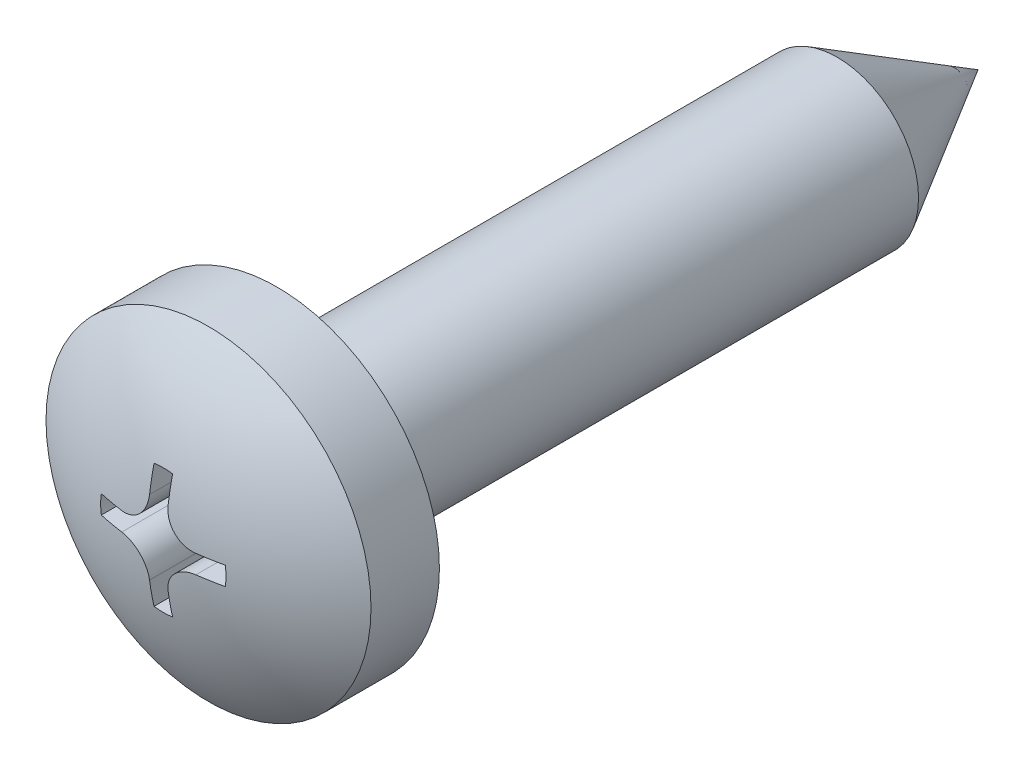
ISO-10303-21;
HEADER;
FILE_DESCRIPTION(('STEP AP214'),'2;1');
FILE_NAME('part.step','',(''),(''),'','','');
FILE_SCHEMA(('AUTOMOTIVE_DESIGN { 1 0 10303 214 1 1 1 1 }'));
ENDSEC;
DATA;
#1=APPLICATION_CONTEXT('core data for automotive mechanical design processes');
#2=APPLICATION_PROTOCOL_DEFINITION('international standard','automotive_design',2000,#1);
#3=PRODUCT_CONTEXT('',#1,'mechanical');
#4=PRODUCT('Part','Part','',(#3));
#5=PRODUCT_RELATED_PRODUCT_CATEGORY('part','',(#4));
#6=PRODUCT_DEFINITION_FORMATION('','',#4);
#7=PRODUCT_DEFINITION_CONTEXT('part definition',#1,'design');
#8=PRODUCT_DEFINITION('design','',#6,#7);
#9=PRODUCT_DEFINITION_SHAPE('','',#8);
#10=(LENGTH_UNIT() NAMED_UNIT(*) SI_UNIT(.MILLI.,.METRE.));
#11=(NAMED_UNIT(*) PLANE_ANGLE_UNIT() SI_UNIT($,.RADIAN.));
#12=(NAMED_UNIT(*) SI_UNIT($,.STERADIAN.) SOLID_ANGLE_UNIT());
#13=UNCERTAINTY_MEASURE_WITH_UNIT(LENGTH_MEASURE(1.E-05),#10,'distance_accuracy_value','');
#14=(GEOMETRIC_REPRESENTATION_CONTEXT(3) GLOBAL_UNCERTAINTY_ASSIGNED_CONTEXT((#13)) GLOBAL_UNIT_ASSIGNED_CONTEXT((#10,
#11,#12)) REPRESENTATION_CONTEXT('',''));
#15=CARTESIAN_POINT('',(0.,0.,0.));
#16=DIRECTION('',(0.,0.,1.));
#17=DIRECTION('',(1.,0.,0.));
#18=AXIS2_PLACEMENT_3D('',#15,#16,#17);
#19=CARTESIAN_POINT('',(0.,0.,11.7));
#20=DIRECTION('',(0.,0.,1.));
#21=DIRECTION('',(0.,1.,0.));
#22=AXIS2_PLACEMENT_3D('',#19,#20,#21);
#23=SPHERICAL_SURFACE('',#22,6.);
#24=CARTESIAN_POINT('',(0.,0.,16.5733971724045));
#25=DIRECTION('',(0.,0.,1.));
#26=DIRECTION('',(1.,0.,0.));
#27=AXIS2_PLACEMENT_3D('',#24,#25,#26);
#28=CIRCLE('',#27,3.5);
#29=CARTESIAN_POINT('',(3.5,0.,16.5733971724045));
#30=VERTEX_POINT('',#29);
#31=EDGE_CURVE('E194',#30,#30,#28,.T.);
#32=ORIENTED_EDGE('',*,*,#31,.T.);
#33=EDGE_LOOP('',(#32));
#34=FACE_BOUND('',#33,.T.);
#35=CARTESIAN_POINT('',(0.,0.,17.5461525809715));
#36=DIRECTION('',(0.,0.,-1.));
#37=DIRECTION('',(-1.,0.,0.));
#38=AXIS2_PLACEMENT_3D('',#35,#36,#37);
#39=CIRCLE('',#38,1.35);
#40=CARTESIAN_POINT('',(0.200000000000001,1.33510299228187,17.5461525809715));
#41=VERTEX_POINT('',#40);
#42=CARTESIAN_POINT('',(-0.199999999999999,1.33510299228187,17.5461525809715));
#43=VERTEX_POINT('',#42);
#44=EDGE_CURVE('E302',#41,#43,#39,.F.);
#45=ORIENTED_EDGE('',*,*,#44,.F.);
#46=CARTESIAN_POINT('',(0.2,0.,11.7));
#47=DIRECTION('',(-1.,0.,0.));
#48=DIRECTION('',(0.,-1.,0.));
#49=AXIS2_PLACEMENT_3D('',#46,#47,#48);
#50=CIRCLE('',#49,5.99666574022598);
#51=CARTESIAN_POINT('',(0.200000000000001,0.797500009462237,17.6433991734451));
#52=VERTEX_POINT('',#51);
#53=EDGE_CURVE('E180',#52,#41,#50,.T.);
#54=ORIENTED_EDGE('',*,*,#53,.F.);
#55=CARTESIAN_POINT('',(0.200000033472805,0.797700009462236,17.6433723323981));
#56=CARTESIAN_POINT('',(0.199959504728963,0.764519819742032,17.6478299285659));
#57=CARTESIAN_POINT('',(0.202740264930581,0.731287998684179,17.6519109789671));
#58=CARTESIAN_POINT('',(0.213785549359492,0.665662531489231,17.6592197594598));
#59=CARTESIAN_POINT('',(0.222048426813984,0.63326863668269,17.6624477453962));
#60=CARTESIAN_POINT('',(0.243908754313069,0.570212135570247,17.6679553467478));
#61=CARTESIAN_POINT('',(0.257510816022339,0.539551052223121,17.6702341387901));
#62=CARTESIAN_POINT('',(0.289673589680053,0.480899154608094,17.6737714972831));
#63=CARTESIAN_POINT('',(0.308232507803272,0.452907379313607,17.675030432144));
#64=CARTESIAN_POINT('',(0.349591538859552,0.400657316609799,17.6764839041002));
#65=CARTESIAN_POINT('',(0.372349744703137,0.376366128591833,17.676688425945));
#66=CARTESIAN_POINT('',(0.421575036649611,0.331896325468018,17.6760538425791));
#67=CARTESIAN_POINT('',(0.448042631377653,0.311718275281566,17.6752145941239));
#68=CARTESIAN_POINT('',(0.503796696795373,0.276122676254471,17.6725234731906));
#69=CARTESIAN_POINT('',(0.533070769454411,0.260685350626951,17.670675899331));
#70=CARTESIAN_POINT('',(0.593696095665992,0.234868098674114,17.6660247852537));
#71=CARTESIAN_POINT('',(0.625046703913454,0.224486609493775,17.6632215409081));
#72=CARTESIAN_POINT('',(0.680056125941739,0.211174358926783,17.65764207382));
#73=CARTESIAN_POINT('',(0.703438393387445,0.206976013958831,17.6550737199313));
#74=CARTESIAN_POINT('',(0.750453457902043,0.201384410275204,17.6495237232986));
#75=CARTESIAN_POINT('',(0.774085850253675,0.199987160794529,17.6465426750142));
#76=CARTESIAN_POINT('',(0.797700009462238,0.200000033472804,17.6433723323981));
#77=B_SPLINE_CURVE_WITH_KNOTS('',3,(#55,#56,#57,#58,#59,#60,#61,#62,#63,#64,#65,#66,#67,#68,#69,
#70,#71,#72,#73,#74,#75,#76),.UNSPECIFIED.,.F.,.F.,(4,2,2,2,2,2,2,2,2,2,4),(0.,
0.100316997355105,0.200603874130029,0.300977563932575,0.401314978835871,0.500700481480781,
0.600099625055628,0.699078290545273,0.798026340399312,0.869548686748045,0.940969061455404),.UNSPECIFIED.);
#78=CARTESIAN_POINT('',(0.797500009462238,0.2,17.6433991734451));
#79=VERTEX_POINT('',#78);
#80=EDGE_CURVE('E292',#52,#79,#77,.T.);
#81=ORIENTED_EDGE('',*,*,#80,.T.);
#82=CARTESIAN_POINT('',(0.,0.200000000000002,11.7));
#83=DIRECTION('',(0.,1.,0.));
#84=DIRECTION('',(-1.,0.,0.));
#85=AXIS2_PLACEMENT_3D('',#82,#83,#84);
#86=CIRCLE('',#85,5.99666574022598);
#87=CARTESIAN_POINT('',(1.33510299228187,0.199999999999998,17.5461525809715));
#88=VERTEX_POINT('',#87);
#89=EDGE_CURVE('E300',#79,#88,#86,.T.);
#90=ORIENTED_EDGE('',*,*,#89,.T.);
#91=CARTESIAN_POINT('',(0.,0.,17.5461525809715));
#92=DIRECTION('',(0.,0.,-1.));
#93=DIRECTION('',(-1.,0.,0.));
#94=AXIS2_PLACEMENT_3D('',#91,#92,#93);
#95=CIRCLE('',#94,1.35);
#96=CARTESIAN_POINT('',(1.33510299228187,-0.199999999999998,17.5461525809715));
#97=VERTEX_POINT('',#96);
#98=EDGE_CURVE('E375',#88,#97,#95,.T.);
#99=ORIENTED_EDGE('',*,*,#98,.T.);
#100=CARTESIAN_POINT('',(0.,-0.200000000000002,11.7));
#101=DIRECTION('',(0.,1.,0.));
#102=DIRECTION('',(-1.,0.,0.));
#103=AXIS2_PLACEMENT_3D('',#100,#101,#102);
#104=CIRCLE('',#103,5.99666574022598);
#105=CARTESIAN_POINT('',(0.797500009462238,-0.2,17.6433991734451));
#106=VERTEX_POINT('',#105);
#107=EDGE_CURVE('E264',#106,#97,#104,.T.);
#108=ORIENTED_EDGE('',*,*,#107,.F.);
#109=CARTESIAN_POINT('',(0.200000033472805,-0.797700009462236,17.6433723323981));
#110=CARTESIAN_POINT('',(0.199959504728963,-0.764519819742032,17.6478299285659));
#111=CARTESIAN_POINT('',(0.202740264930581,-0.731287998684179,17.6519109789671));
#112=CARTESIAN_POINT('',(0.213785549359492,-0.665662531489231,17.6592197594598));
#113=CARTESIAN_POINT('',(0.222048426813984,-0.63326863668269,17.6624477453962));
#114=CARTESIAN_POINT('',(0.243908754313069,-0.570212135570247,17.6679553467478));
#115=CARTESIAN_POINT('',(0.257510816022339,-0.539551052223121,17.6702341387901));
#116=CARTESIAN_POINT('',(0.289673589680053,-0.480899154608094,17.6737714972831));
#117=CARTESIAN_POINT('',(0.308232507803272,-0.452907379313607,17.675030432144));
#118=CARTESIAN_POINT('',(0.349591538859552,-0.400657316609799,17.6764839041002));
#119=CARTESIAN_POINT('',(0.372349744703137,-0.376366128591833,17.676688425945));
#120=CARTESIAN_POINT('',(0.421575036649611,-0.331896325468018,17.6760538425791));
#121=CARTESIAN_POINT('',(0.448042631377653,-0.311718275281566,17.6752145941239));
#122=CARTESIAN_POINT('',(0.503796696795373,-0.276122676254471,17.6725234731906));
#123=CARTESIAN_POINT('',(0.533070769454411,-0.260685350626951,17.670675899331));
#124=CARTESIAN_POINT('',(0.593696095665992,-0.234868098674114,17.6660247852537));
#125=CARTESIAN_POINT('',(0.625046703913454,-0.224486609493775,17.6632215409081));
#126=CARTESIAN_POINT('',(0.680056125941739,-0.211174358926783,17.65764207382));
#127=CARTESIAN_POINT('',(0.703438393387445,-0.206976013958831,17.6550737199313));
#128=CARTESIAN_POINT('',(0.750453457902043,-0.201384410275204,17.6495237232986));
#129=CARTESIAN_POINT('',(0.774085850253675,-0.199987160794529,17.6465426750142));
#130=CARTESIAN_POINT('',(0.797700009462237,-0.200000033472804,17.6433723323981));
#131=B_SPLINE_CURVE_WITH_KNOTS('',3,(#109,#110,#111,#112,#113,#114,#115,#116,#117,#118,#119,
#120,#121,#122,#123,#124,#125,#126,#127,#128,#129,#130),.UNSPECIFIED.,.F.,.F.,(4,2,2,2,2,2,2,2,
2,2,4),(0.,0.100316997355105,0.200603874130029,0.300977563932575,0.40131497883587,
0.500700481480781,0.600099625055628,0.699078290545273,0.798026340399312,0.869548686748045,
0.940969061455404),.UNSPECIFIED.);
#132=CARTESIAN_POINT('',(0.200000000000001,-0.797500009462237,17.6433991734451));
#133=VERTEX_POINT('',#132);
#134=EDGE_CURVE('E257',#133,#106,#131,.T.);
#135=ORIENTED_EDGE('',*,*,#134,.F.);
#136=CARTESIAN_POINT('',(0.2,0.,11.7));
#137=DIRECTION('',(1.,0.,0.));
#138=DIRECTION('',(0.,1.,0.));
#139=AXIS2_PLACEMENT_3D('',#136,#137,#138);
#140=CIRCLE('',#139,5.99666574022598);
#141=CARTESIAN_POINT('',(0.200000000000001,-1.33510299228187,17.5461525809715));
#142=VERTEX_POINT('',#141);
#143=EDGE_CURVE('E254',#133,#142,#140,.T.);
#144=ORIENTED_EDGE('',*,*,#143,.T.);
#145=CARTESIAN_POINT('',(0.,0.,17.5461525809715));
#146=DIRECTION('',(0.,0.,-1.));
#147=DIRECTION('',(-1.,0.,0.));
#148=AXIS2_PLACEMENT_3D('',#145,#146,#147);
#149=CIRCLE('',#148,1.35);
#150=CARTESIAN_POINT('',(-0.199999999999999,-1.33510299228187,17.5461525809715));
#151=VERTEX_POINT('',#150);
#152=EDGE_CURVE('E251',#142,#151,#149,.T.);
#153=ORIENTED_EDGE('',*,*,#152,.T.);
#154=CARTESIAN_POINT('',(-0.2,0.,11.7));
#155=DIRECTION('',(1.,0.,0.));
#156=DIRECTION('',(0.,1.,0.));
#157=AXIS2_PLACEMENT_3D('',#154,#155,#156);
#158=CIRCLE('',#157,5.99666574022598);
#159=CARTESIAN_POINT('',(-0.2,-0.797500009462236,17.6433991734451));
#160=VERTEX_POINT('',#159);
#161=EDGE_CURVE('E248',#160,#151,#158,.T.);
#162=ORIENTED_EDGE('',*,*,#161,.F.);
#163=CARTESIAN_POINT('',(-0.200000033472803,-0.797700009462235,17.6433723323981));
#164=CARTESIAN_POINT('',(-0.199959504728962,-0.764519819742031,17.6478299285659));
#165=CARTESIAN_POINT('',(-0.20274026493058,-0.731287998684178,17.6519109789671));
#166=CARTESIAN_POINT('',(-0.213785549359491,-0.66566253148923,17.6592197594598));
#167=CARTESIAN_POINT('',(-0.222048426813983,-0.633268636682689,17.6624477453962));
#168=CARTESIAN_POINT('',(-0.243908754313068,-0.570212135570245,17.6679553467478));
#169=CARTESIAN_POINT('',(-0.257510816022338,-0.53955105222312,17.6702341387901));
#170=CARTESIAN_POINT('',(-0.289673589680052,-0.480899154608093,17.6737714972831));
#171=CARTESIAN_POINT('',(-0.308232507803271,-0.452907379313606,17.675030432144));
#172=CARTESIAN_POINT('',(-0.34959153885955,-0.400657316609798,17.6764839041002));
#173=CARTESIAN_POINT('',(-0.372349744703136,-0.376366128591832,17.676688425945));
#174=CARTESIAN_POINT('',(-0.421575036649609,-0.331896325468017,17.6760538425791));
#175=CARTESIAN_POINT('',(-0.448042631377652,-0.311718275281565,17.6752145941239));
#176=CARTESIAN_POINT('',(-0.503796696795372,-0.27612267625447,17.6725234731906));
#177=CARTESIAN_POINT('',(-0.53307076945441,-0.26068535062695,17.670675899331));
#178=CARTESIAN_POINT('',(-0.59369609566599,-0.234868098674113,17.6660247852537));
#179=CARTESIAN_POINT('',(-0.625046703913452,-0.224486609493775,17.6632215409081));
#180=CARTESIAN_POINT('',(-0.680056125941737,-0.211174358926782,17.65764207382));
#181=CARTESIAN_POINT('',(-0.703438393387443,-0.20697601395883,17.6550737199313));
#182=CARTESIAN_POINT('',(-0.750453457902041,-0.201384410275203,17.6495237232986));
#183=CARTESIAN_POINT('',(-0.774085850253673,-0.199987160794528,17.6465426750142));
#184=CARTESIAN_POINT('',(-0.797700009462236,-0.200000033472803,17.6433723323981));
#185=B_SPLINE_CURVE_WITH_KNOTS('',3,(#163,#164,#165,#166,#167,#168,#169,#170,#171,#172,#173,
#174,#175,#176,#177,#178,#179,#180,#181,#182,#183,#184),.UNSPECIFIED.,.F.,.F.,(4,2,2,2,2,2,2,2,
2,2,4),(0.,0.100316997355106,0.200603874130029,0.300977563932575,0.40131497883587,
0.50070048148078,0.600099625055628,0.699078290545272,0.798026340399311,0.869548686748044,
0.940969061455402),.UNSPECIFIED.);
#186=CARTESIAN_POINT('',(-0.797500009462236,-0.199999999999999,17.6433991734451));
#187=VERTEX_POINT('',#186);
#188=EDGE_CURVE('E240',#160,#187,#185,.T.);
#189=ORIENTED_EDGE('',*,*,#188,.T.);
#190=CARTESIAN_POINT('',(0.,-0.2,11.7));
#191=DIRECTION('',(0.,-1.,0.));
#192=DIRECTION('',(1.,0.,0.));
#193=AXIS2_PLACEMENT_3D('',#190,#191,#192);
#194=CIRCLE('',#193,5.99666574022598);
#195=CARTESIAN_POINT('',(-1.33510299228187,-0.199999999999999,17.5461525809715));
#196=VERTEX_POINT('',#195);
#197=EDGE_CURVE('E249',#187,#196,#194,.T.);
#198=ORIENTED_EDGE('',*,*,#197,.T.);
#199=CARTESIAN_POINT('',(0.,0.,17.5461525809715));
#200=DIRECTION('',(0.,0.,-1.));
#201=DIRECTION('',(-1.,0.,0.));
#202=AXIS2_PLACEMENT_3D('',#199,#200,#201);
#203=CIRCLE('',#202,1.35);
#204=CARTESIAN_POINT('',(-1.33510299228187,0.199999999999999,17.5461525809715));
#205=VERTEX_POINT('',#204);
#206=EDGE_CURVE('E414',#205,#196,#203,.F.);
#207=ORIENTED_EDGE('',*,*,#206,.F.);
#208=CARTESIAN_POINT('',(0.,0.2,11.7));
#209=DIRECTION('',(0.,-1.,0.));
#210=DIRECTION('',(1.,0.,0.));
#211=AXIS2_PLACEMENT_3D('',#208,#209,#210);
#212=CIRCLE('',#211,5.99666574022598);
#213=CARTESIAN_POINT('',(-0.797500009462236,0.199999999999999,17.6433991734451));
#214=VERTEX_POINT('',#213);
#215=EDGE_CURVE('E208',#214,#205,#212,.T.);
#216=ORIENTED_EDGE('',*,*,#215,.F.);
#217=CARTESIAN_POINT('',(-0.200000033472804,0.797700009462235,17.6433723323981));
#218=CARTESIAN_POINT('',(-0.199959504728962,0.764519819742031,17.6478299285659));
#219=CARTESIAN_POINT('',(-0.20274026493058,0.731287998684178,17.6519109789671));
#220=CARTESIAN_POINT('',(-0.213785549359491,0.66566253148923,17.6592197594598));
#221=CARTESIAN_POINT('',(-0.222048426813983,0.633268636682689,17.6624477453962));
#222=CARTESIAN_POINT('',(-0.243908754313068,0.570212135570246,17.6679553467478));
#223=CARTESIAN_POINT('',(-0.257510816022338,0.53955105222312,17.6702341387901));
#224=CARTESIAN_POINT('',(-0.289673589680052,0.480899154608093,17.6737714972831));
#225=CARTESIAN_POINT('',(-0.308232507803271,0.452907379313606,17.675030432144));
#226=CARTESIAN_POINT('',(-0.349591538859551,0.400657316609798,17.6764839041002));
#227=CARTESIAN_POINT('',(-0.372349744703136,0.376366128591832,17.676688425945));
#228=CARTESIAN_POINT('',(-0.421575036649609,0.331896325468017,17.6760538425791));
#229=CARTESIAN_POINT('',(-0.448042631377652,0.311718275281565,17.6752145941239));
#230=CARTESIAN_POINT('',(-0.503796696795372,0.27612267625447,17.6725234731906));
#231=CARTESIAN_POINT('',(-0.53307076945441,0.26068535062695,17.670675899331));
#232=CARTESIAN_POINT('',(-0.59369609566599,0.234868098674113,17.6660247852537));
#233=CARTESIAN_POINT('',(-0.625046703913453,0.224486609493774,17.6632215409081));
#234=CARTESIAN_POINT('',(-0.680056125941738,0.211174358926782,17.65764207382));
#235=CARTESIAN_POINT('',(-0.703438393387444,0.20697601395883,17.6550737199313));
#236=CARTESIAN_POINT('',(-0.750453457902041,0.201384410275202,17.6495237232986));
#237=CARTESIAN_POINT('',(-0.774085850253673,0.199987160794528,17.6465426750142));
#238=CARTESIAN_POINT('',(-0.797700009462236,0.200000033472803,17.6433723323981));
#239=B_SPLINE_CURVE_WITH_KNOTS('',3,(#217,#218,#219,#220,#221,#222,#223,#224,#225,#226,#227,
#228,#229,#230,#231,#232,#233,#234,#235,#236,#237,#238),.UNSPECIFIED.,.F.,.F.,(4,2,2,2,2,2,2,2,
2,2,4),(0.,0.100316997355105,0.200603874130029,0.300977563932575,0.401314978835871,
0.500700481480781,0.600099625055628,0.699078290545273,0.798026340399312,0.869548686748044,
0.940969061455403),.UNSPECIFIED.);
#240=CARTESIAN_POINT('',(-0.2,0.797500009462236,17.6433991734451));
#241=VERTEX_POINT('',#240);
#242=EDGE_CURVE('E200',#241,#214,#239,.T.);
#243=ORIENTED_EDGE('',*,*,#242,.F.);
#244=CARTESIAN_POINT('',(-0.2,0.,11.7));
#245=DIRECTION('',(-1.,0.,0.));
#246=DIRECTION('',(0.,-1.,0.));
#247=AXIS2_PLACEMENT_3D('',#244,#245,#246);
#248=CIRCLE('',#247,5.99666574022598);
#249=EDGE_CURVE('E197',#241,#43,#248,.T.);
#250=ORIENTED_EDGE('',*,*,#249,.T.);
#251=EDGE_LOOP('',(#45,#54,#81,#90,#99,#108,#135,#144,#153,#162,#189,#198,#207,#216,#243,#250));
#252=FACE_BOUND('',#251,.T.);
#253=ADVANCED_FACE('F45',(#34,#252),#23,.T.);
#254=CARTESIAN_POINT('',(0.,0.,0.));
#255=DIRECTION('',(0.,0.,1.));
#256=DIRECTION('',(1.,0.,0.));
#257=AXIS2_PLACEMENT_3D('',#254,#255,#256);
#258=CONICAL_SURFACE('',#257,0.,0.523598775598293);
#259=CARTESIAN_POINT('',(0.,0.,3.03108891324558));
#260=DIRECTION('',(0.,0.,1.));
#261=DIRECTION('',(1.,0.,0.));
#262=AXIS2_PLACEMENT_3D('',#259,#260,#261);
#263=CIRCLE('',#262,1.75);
#264=CARTESIAN_POINT('',(1.75,0.,3.03108891324558));
#265=VERTEX_POINT('',#264);
#266=EDGE_CURVE('E181',#265,#265,#263,.T.);
#267=ORIENTED_EDGE('',*,*,#266,.F.);
#268=EDGE_LOOP('',(#267));
#269=FACE_BOUND('',#268,.T.);
#270=CARTESIAN_POINT('',(0.,0.,0.));
#271=VERTEX_POINT('',#270);
#272=VERTEX_LOOP('',#271);
#273=FACE_BOUND('',#272,.T.);
#274=ADVANCED_FACE('F316',(#269,#273),#258,.T.);
#275=CARTESIAN_POINT('',(0.,0.,11.71));
#276=DIRECTION('',(0.,0.,1.));
#277=DIRECTION('',(1.,0.,0.));
#278=AXIS2_PLACEMENT_3D('',#275,#276,#277);
#279=CYLINDRICAL_SURFACE('',#278,3.5);
#280=ORIENTED_EDGE('',*,*,#31,.F.);
#281=EDGE_LOOP('',(#280));
#282=FACE_BOUND('',#281,.T.);
#283=CARTESIAN_POINT('',(0.,0.,15.1));
#284=DIRECTION('',(0.,0.,1.));
#285=DIRECTION('',(1.,0.,0.));
#286=AXIS2_PLACEMENT_3D('',#283,#284,#285);
#287=CIRCLE('',#286,3.5);
#288=CARTESIAN_POINT('',(3.5,0.,15.1));
#289=VERTEX_POINT('',#288);
#290=EDGE_CURVE('E185',#289,#289,#287,.T.);
#291=ORIENTED_EDGE('',*,*,#290,.T.);
#292=EDGE_LOOP('',(#291));
#293=FACE_BOUND('',#292,.T.);
#294=ADVANCED_FACE('F321',(#282,#293),#279,.T.);
#295=CARTESIAN_POINT('',(0.,3.5,15.1));
#296=DIRECTION('',(0.,0.,1.));
#297=DIRECTION('',(1.,0.,0.));
#298=AXIS2_PLACEMENT_3D('',#295,#296,#297);
#299=PLANE('',#298);
#300=CARTESIAN_POINT('',(0.,0.,15.1));
#301=DIRECTION('',(0.,0.,1.));
#302=DIRECTION('',(1.,0.,0.));
#303=AXIS2_PLACEMENT_3D('',#300,#301,#302);
#304=CIRCLE('',#303,1.85);
#305=CARTESIAN_POINT('',(1.85,0.,15.1));
#306=VERTEX_POINT('',#305);
#307=EDGE_CURVE('E54',#306,#306,#304,.T.);
#308=ORIENTED_EDGE('',*,*,#307,.T.);
#309=EDGE_LOOP('',(#308));
#310=FACE_BOUND('',#309,.T.);
#311=ORIENTED_EDGE('',*,*,#290,.F.);
#312=EDGE_LOOP('',(#311));
#313=FACE_BOUND('',#312,.T.);
#314=ADVANCED_FACE('F306',(#310,#313),#299,.F.);
#315=CARTESIAN_POINT('',(0.,0.,11.71));
#316=DIRECTION('',(0.,0.,1.));
#317=DIRECTION('',(1.,0.,0.));
#318=AXIS2_PLACEMENT_3D('',#315,#316,#317);
#319=CYLINDRICAL_SURFACE('',#318,1.75);
#320=CARTESIAN_POINT('',(0.,0.,15.));
#321=DIRECTION('',(0.,0.,1.));
#322=DIRECTION('',(1.,0.,0.));
#323=AXIS2_PLACEMENT_3D('',#320,#321,#322);
#324=CIRCLE('',#323,1.75);
#325=CARTESIAN_POINT('',(1.75,0.,15.));
#326=VERTEX_POINT('',#325);
#327=EDGE_CURVE('E11',#326,#326,#324,.F.);
#328=ORIENTED_EDGE('',*,*,#327,.T.);
#329=EDGE_LOOP('',(#328));
#330=FACE_BOUND('',#329,.T.);
#331=ORIENTED_EDGE('',*,*,#266,.T.);
#332=EDGE_LOOP('',(#331));
#333=FACE_BOUND('',#332,.T.);
#334=ADVANCED_FACE('F468',(#330,#333),#319,.T.);
#335=CARTESIAN_POINT('',(0.,0.,16.15));
#336=DIRECTION('',(0.,0.,1.));
#337=DIRECTION('',(1.,0.,0.));
#338=AXIS2_PLACEMENT_3D('',#335,#336,#337);
#339=CYLINDRICAL_SURFACE('',#338,1.35);
#340=ORIENTED_EDGE('',*,*,#44,.T.);
#341=DIRECTION('',(0.,0.,1.));
#342=VECTOR('',#341,1.);
#343=CARTESIAN_POINT('',(-0.199999999999999,1.33510299228187,16.15));
#344=LINE('',#343,#342);
#345=CARTESIAN_POINT('',(-0.199999999999999,1.33510299228187,16.15));
#346=VERTEX_POINT('',#345);
#347=EDGE_CURVE('E61',#346,#43,#344,.T.);
#348=ORIENTED_EDGE('',*,*,#347,.F.);
#349=CARTESIAN_POINT('',(0.,0.,16.15));
#350=DIRECTION('',(0.,0.,-1.));
#351=DIRECTION('',(-1.,0.,0.));
#352=AXIS2_PLACEMENT_3D('',#349,#350,#351);
#353=CIRCLE('',#352,1.35);
#354=CARTESIAN_POINT('',(0.200000000000001,1.33510299228187,16.15));
#355=VERTEX_POINT('',#354);
#356=EDGE_CURVE('E163',#346,#355,#353,.T.);
#357=ORIENTED_EDGE('',*,*,#356,.T.);
#358=DIRECTION('',(0.,0.,1.));
#359=VECTOR('',#358,1.);
#360=CARTESIAN_POINT('',(0.200000000000001,1.33510299228187,16.15));
#361=LINE('',#360,#359);
#362=EDGE_CURVE('E175',#355,#41,#361,.T.);
#363=ORIENTED_EDGE('',*,*,#362,.T.);
#364=EDGE_LOOP('',(#340,#348,#357,#363));
#365=FACE_BOUND('',#364,.T.);
#366=ADVANCED_FACE('F174',(#365),#339,.F.);
#367=CARTESIAN_POINT('',(0.200000000000001,1.33510299228187,16.15));
#368=DIRECTION('',(-1.,0.,0.));
#369=DIRECTION('',(0.,-1.,0.));
#370=AXIS2_PLACEMENT_3D('',#367,#368,#369);
#371=PLANE('',#370);
#372=ORIENTED_EDGE('',*,*,#53,.T.);
#373=ORIENTED_EDGE('',*,*,#362,.F.);
#374=DIRECTION('',(0.,-1.,0.));
#375=VECTOR('',#374,1.);
#376=CARTESIAN_POINT('',(0.200000000000001,1.33510299228187,16.15));
#377=LINE('',#376,#375);
#378=CARTESIAN_POINT('',(0.200000000000001,0.797500009462237,16.15));
#379=VERTEX_POINT('',#378);
#380=EDGE_CURVE('E159',#355,#379,#377,.T.);
#381=ORIENTED_EDGE('',*,*,#380,.T.);
#382=DIRECTION('',(0.,0.,1.));
#383=VECTOR('',#382,1.);
#384=CARTESIAN_POINT('',(0.200000000000001,0.797500009462237,16.15));
#385=LINE('',#384,#383);
#386=EDGE_CURVE('E182',#379,#52,#385,.T.);
#387=ORIENTED_EDGE('',*,*,#386,.T.);
#388=EDGE_LOOP('',(#372,#373,#381,#387));
#389=FACE_BOUND('',#388,.T.);
#390=ADVANCED_FACE('F178',(#389),#371,.T.);
#391=CARTESIAN_POINT('',(0.797500009462238,0.797500009462237,16.15));
#392=DIRECTION('',(0.,0.,1.));
#393=DIRECTION('',(1.,0.,0.));
#394=AXIS2_PLACEMENT_3D('',#391,#392,#393);
#395=CYLINDRICAL_SURFACE('',#394,0.597500009462237);
#396=ORIENTED_EDGE('',*,*,#386,.F.);
#397=CARTESIAN_POINT('',(0.797500009462238,0.797500009462237,16.15));
#398=DIRECTION('',(0.,0.,-1.));
#399=DIRECTION('',(-1.,0.,0.));
#400=AXIS2_PLACEMENT_3D('',#397,#398,#399);
#401=CIRCLE('',#400,0.597500009462237);
#402=CARTESIAN_POINT('',(0.797500009462238,0.2,16.15));
#403=VERTEX_POINT('',#402);
#404=EDGE_CURVE('E166',#403,#379,#401,.T.);
#405=ORIENTED_EDGE('',*,*,#404,.F.);
#406=DIRECTION('',(0.,0.,1.));
#407=VECTOR('',#406,1.);
#408=CARTESIAN_POINT('',(0.797500009462238,0.2,16.15));
#409=LINE('',#408,#407);
#410=EDGE_CURVE('E187',#403,#79,#409,.T.);
#411=ORIENTED_EDGE('',*,*,#410,.T.);
#412=ORIENTED_EDGE('',*,*,#80,.F.);
#413=EDGE_LOOP('',(#396,#405,#411,#412));
#414=FACE_BOUND('',#413,.T.);
#415=ADVANCED_FACE('F284',(#414),#395,.T.);
#416=CARTESIAN_POINT('',(1.33510299228187,0.199999999999998,16.15));
#417=DIRECTION('',(0.,1.,0.));
#418=DIRECTION('',(-1.,0.,0.));
#419=AXIS2_PLACEMENT_3D('',#416,#417,#418);
#420=PLANE('',#419);
#421=ORIENTED_EDGE('',*,*,#410,.F.);
#422=DIRECTION('',(-1.,0.,0.));
#423=VECTOR('',#422,1.);
#424=CARTESIAN_POINT('',(1.33510299228187,0.199999999999998,16.15));
#425=LINE('',#424,#423);
#426=CARTESIAN_POINT('',(1.33510299228187,0.199999999999998,16.15));
#427=VERTEX_POINT('',#426);
#428=EDGE_CURVE('E383',#427,#403,#425,.T.);
#429=ORIENTED_EDGE('',*,*,#428,.F.);
#430=DIRECTION('',(0.,0.,1.));
#431=VECTOR('',#430,1.);
#432=CARTESIAN_POINT('',(1.33510299228187,0.199999999999998,16.15));
#433=LINE('',#432,#431);
#434=EDGE_CURVE('E368',#427,#88,#433,.T.);
#435=ORIENTED_EDGE('',*,*,#434,.T.);
#436=ORIENTED_EDGE('',*,*,#89,.F.);
#437=EDGE_LOOP('',(#421,#429,#435,#436));
#438=FACE_BOUND('',#437,.T.);
#439=ADVANCED_FACE('F280',(#438),#420,.F.);
#440=CARTESIAN_POINT('',(0.,0.,16.15));
#441=DIRECTION('',(0.,0.,1.));
#442=DIRECTION('',(1.,0.,0.));
#443=AXIS2_PLACEMENT_3D('',#440,#441,#442);
#444=CYLINDRICAL_SURFACE('',#443,1.35);
#445=ORIENTED_EDGE('',*,*,#434,.F.);
#446=CARTESIAN_POINT('',(0.,0.,16.15));
#447=DIRECTION('',(0.,0.,1.));
#448=DIRECTION('',(1.,0.,0.));
#449=AXIS2_PLACEMENT_3D('',#446,#447,#448);
#450=CIRCLE('',#449,1.35);
#451=CARTESIAN_POINT('',(1.33510299228187,-0.199999999999999,16.15));
#452=VERTEX_POINT('',#451);
#453=EDGE_CURVE('E381',#452,#427,#450,.T.);
#454=ORIENTED_EDGE('',*,*,#453,.F.);
#455=DIRECTION('',(0.,0.,1.));
#456=VECTOR('',#455,1.);
#457=CARTESIAN_POINT('',(1.33510299228187,-0.199999999999999,16.15));
#458=LINE('',#457,#456);
#459=EDGE_CURVE('E365',#452,#97,#458,.T.);
#460=ORIENTED_EDGE('',*,*,#459,.T.);
#461=ORIENTED_EDGE('',*,*,#98,.F.);
#462=EDGE_LOOP('',(#445,#454,#460,#461));
#463=FACE_BOUND('',#462,.T.);
#464=ADVANCED_FACE('F276',(#463),#444,.F.);
#465=CARTESIAN_POINT('',(1.33510299228187,-0.199999999999998,16.15));
#466=DIRECTION('',(0.,1.,0.));
#467=DIRECTION('',(-1.,0.,0.));
#468=AXIS2_PLACEMENT_3D('',#465,#466,#467);
#469=PLANE('',#468);
#470=ORIENTED_EDGE('',*,*,#107,.T.);
#471=ORIENTED_EDGE('',*,*,#459,.F.);
#472=DIRECTION('',(-1.,0.,0.));
#473=VECTOR('',#472,1.);
#474=CARTESIAN_POINT('',(1.33510299228187,-0.199999999999998,16.15));
#475=LINE('',#474,#473);
#476=CARTESIAN_POINT('',(0.797500009462238,-0.2,16.15));
#477=VERTEX_POINT('',#476);
#478=EDGE_CURVE('E382',#452,#477,#475,.T.);
#479=ORIENTED_EDGE('',*,*,#478,.T.);
#480=DIRECTION('',(0.,0.,1.));
#481=VECTOR('',#480,1.);
#482=CARTESIAN_POINT('',(0.797500009462238,-0.2,16.15));
#483=LINE('',#482,#481);
#484=EDGE_CURVE('E362',#477,#106,#483,.T.);
#485=ORIENTED_EDGE('',*,*,#484,.T.);
#486=EDGE_LOOP('',(#470,#471,#479,#485));
#487=FACE_BOUND('',#486,.T.);
#488=ADVANCED_FACE('F272',(#487),#469,.T.);
#489=CARTESIAN_POINT('',(0.797500009462238,-0.797500009462237,16.15));
#490=DIRECTION('',(0.,0.,1.));
#491=DIRECTION('',(1.,0.,0.));
#492=AXIS2_PLACEMENT_3D('',#489,#490,#491);
#493=CYLINDRICAL_SURFACE('',#492,0.597500009462237);
#494=ORIENTED_EDGE('',*,*,#134,.T.);
#495=ORIENTED_EDGE('',*,*,#484,.F.);
#496=CARTESIAN_POINT('',(0.797500009462238,-0.797500009462237,16.15));
#497=DIRECTION('',(0.,0.,1.));
#498=DIRECTION('',(1.,0.,0.));
#499=AXIS2_PLACEMENT_3D('',#496,#497,#498);
#500=CIRCLE('',#499,0.597500009462237);
#501=CARTESIAN_POINT('',(0.200000000000001,-0.797500009462237,16.15));
#502=VERTEX_POINT('',#501);
#503=EDGE_CURVE('E385',#477,#502,#500,.T.);
#504=ORIENTED_EDGE('',*,*,#503,.T.);
#505=DIRECTION('',(0.,0.,1.));
#506=VECTOR('',#505,1.);
#507=CARTESIAN_POINT('',(0.200000000000001,-0.797500009462237,16.15));
#508=LINE('',#507,#506);
#509=EDGE_CURVE('E359',#502,#133,#508,.T.);
#510=ORIENTED_EDGE('',*,*,#509,.T.);
#511=EDGE_LOOP('',(#494,#495,#504,#510));
#512=FACE_BOUND('',#511,.T.);
#513=ADVANCED_FACE('F266',(#512),#493,.T.);
#514=CARTESIAN_POINT('',(0.200000000000001,-1.33510299228187,16.15));
#515=DIRECTION('',(1.,0.,0.));
#516=DIRECTION('',(0.,1.,0.));
#517=AXIS2_PLACEMENT_3D('',#514,#515,#516);
#518=PLANE('',#517);
#519=ORIENTED_EDGE('',*,*,#509,.F.);
#520=DIRECTION('',(0.,1.,0.));
#521=VECTOR('',#520,1.);
#522=CARTESIAN_POINT('',(0.200000000000001,-1.33510299228187,16.15));
#523=LINE('',#522,#521);
#524=CARTESIAN_POINT('',(0.200000000000001,-1.33510299228187,16.15));
#525=VERTEX_POINT('',#524);
#526=EDGE_CURVE('E391',#525,#502,#523,.T.);
#527=ORIENTED_EDGE('',*,*,#526,.F.);
#528=DIRECTION('',(0.,0.,1.));
#529=VECTOR('',#528,1.);
#530=CARTESIAN_POINT('',(0.200000000000001,-1.33510299228187,16.15));
#531=LINE('',#530,#529);
#532=EDGE_CURVE('E356',#525,#142,#531,.T.);
#533=ORIENTED_EDGE('',*,*,#532,.T.);
#534=ORIENTED_EDGE('',*,*,#143,.F.);
#535=EDGE_LOOP('',(#519,#527,#533,#534));
#536=FACE_BOUND('',#535,.T.);
#537=ADVANCED_FACE('F271',(#536),#518,.F.);
#538=CARTESIAN_POINT('',(0.,0.,16.15));
#539=DIRECTION('',(0.,0.,1.));
#540=DIRECTION('',(1.,0.,0.));
#541=AXIS2_PLACEMENT_3D('',#538,#539,#540);
#542=CYLINDRICAL_SURFACE('',#541,1.35);
#543=ORIENTED_EDGE('',*,*,#532,.F.);
#544=CARTESIAN_POINT('',(0.,0.,16.15));
#545=DIRECTION('',(0.,0.,1.));
#546=DIRECTION('',(1.,0.,0.));
#547=AXIS2_PLACEMENT_3D('',#544,#545,#546);
#548=CIRCLE('',#547,1.35);
#549=CARTESIAN_POINT('',(-0.2,-1.33510299228187,16.15));
#550=VERTEX_POINT('',#549);
#551=EDGE_CURVE('E394',#550,#525,#548,.T.);
#552=ORIENTED_EDGE('',*,*,#551,.F.);
#553=DIRECTION('',(0.,0.,1.));
#554=VECTOR('',#553,1.);
#555=CARTESIAN_POINT('',(-0.2,-1.33510299228187,16.15));
#556=LINE('',#555,#554);
#557=EDGE_CURVE('E353',#550,#151,#556,.T.);
#558=ORIENTED_EDGE('',*,*,#557,.T.);
#559=ORIENTED_EDGE('',*,*,#152,.F.);
#560=EDGE_LOOP('',(#543,#552,#558,#559));
#561=FACE_BOUND('',#560,.T.);
#562=ADVANCED_FACE('F423',(#561),#542,.F.);
#563=CARTESIAN_POINT('',(-0.199999999999999,-1.33510299228187,16.15));
#564=DIRECTION('',(1.,0.,0.));
#565=DIRECTION('',(0.,1.,0.));
#566=AXIS2_PLACEMENT_3D('',#563,#564,#565);
#567=PLANE('',#566);
#568=ORIENTED_EDGE('',*,*,#161,.T.);
#569=ORIENTED_EDGE('',*,*,#557,.F.);
#570=DIRECTION('',(0.,1.,0.));
#571=VECTOR('',#570,1.);
#572=CARTESIAN_POINT('',(-0.199999999999999,-1.33510299228187,16.15));
#573=LINE('',#572,#571);
#574=CARTESIAN_POINT('',(-0.2,-0.797500009462236,16.15));
#575=VERTEX_POINT('',#574);
#576=EDGE_CURVE('E397',#550,#575,#573,.T.);
#577=ORIENTED_EDGE('',*,*,#576,.T.);
#578=DIRECTION('',(0.,0.,1.));
#579=VECTOR('',#578,1.);
#580=CARTESIAN_POINT('',(-0.2,-0.797500009462236,16.15));
#581=LINE('',#580,#579);
#582=EDGE_CURVE('E350',#575,#160,#581,.T.);
#583=ORIENTED_EDGE('',*,*,#582,.T.);
#584=EDGE_LOOP('',(#568,#569,#577,#583));
#585=FACE_BOUND('',#584,.T.);
#586=ADVANCED_FACE('F236',(#585),#567,.T.);
#587=CARTESIAN_POINT('',(-0.797500009462237,-0.797500009462236,16.15));
#588=DIRECTION('',(0.,0.,1.));
#589=DIRECTION('',(1.,0.,0.));
#590=AXIS2_PLACEMENT_3D('',#587,#588,#589);
#591=CYLINDRICAL_SURFACE('',#590,0.597500009462237);
#592=ORIENTED_EDGE('',*,*,#582,.F.);
#593=CARTESIAN_POINT('',(-0.797500009462237,-0.797500009462236,16.15));
#594=DIRECTION('',(0.,0.,-1.));
#595=DIRECTION('',(-1.,0.,0.));
#596=AXIS2_PLACEMENT_3D('',#593,#594,#595);
#597=CIRCLE('',#596,0.597500009462237);
#598=CARTESIAN_POINT('',(-0.797500009462236,-0.199999999999999,16.15));
#599=VERTEX_POINT('',#598);
#600=EDGE_CURVE('E399',#599,#575,#597,.T.);
#601=ORIENTED_EDGE('',*,*,#600,.F.);
#602=DIRECTION('',(0.,0.,1.));
#603=VECTOR('',#602,1.);
#604=CARTESIAN_POINT('',(-0.797500009462236,-0.199999999999999,16.15));
#605=LINE('',#604,#603);
#606=EDGE_CURVE('E347',#599,#187,#605,.T.);
#607=ORIENTED_EDGE('',*,*,#606,.T.);
#608=ORIENTED_EDGE('',*,*,#188,.F.);
#609=EDGE_LOOP('',(#592,#601,#607,#608));
#610=FACE_BOUND('',#609,.T.);
#611=ADVANCED_FACE('F231',(#610),#591,.T.);
#612=CARTESIAN_POINT('',(-1.33510299228187,-0.199999999999999,16.15));
#613=DIRECTION('',(0.,-1.,0.));
#614=DIRECTION('',(1.,0.,0.));
#615=AXIS2_PLACEMENT_3D('',#612,#613,#614);
#616=PLANE('',#615);
#617=ORIENTED_EDGE('',*,*,#606,.F.);
#618=DIRECTION('',(1.,0.,0.));
#619=VECTOR('',#618,1.);
#620=CARTESIAN_POINT('',(-1.33510299228187,-0.199999999999999,16.15));
#621=LINE('',#620,#619);
#622=CARTESIAN_POINT('',(-1.33510299228187,-0.199999999999999,16.15));
#623=VERTEX_POINT('',#622);
#624=EDGE_CURVE('E402',#623,#599,#621,.T.);
#625=ORIENTED_EDGE('',*,*,#624,.F.);
#626=DIRECTION('',(0.,0.,1.));
#627=VECTOR('',#626,1.);
#628=CARTESIAN_POINT('',(-1.33510299228187,-0.199999999999999,16.15));
#629=LINE('',#628,#627);
#630=EDGE_CURVE('E344',#623,#196,#629,.T.);
#631=ORIENTED_EDGE('',*,*,#630,.T.);
#632=ORIENTED_EDGE('',*,*,#197,.F.);
#633=EDGE_LOOP('',(#617,#625,#631,#632));
#634=FACE_BOUND('',#633,.T.);
#635=ADVANCED_FACE('F227',(#634),#616,.F.);
#636=CARTESIAN_POINT('',(0.,0.,16.15));
#637=DIRECTION('',(0.,0.,1.));
#638=DIRECTION('',(1.,0.,0.));
#639=AXIS2_PLACEMENT_3D('',#636,#637,#638);
#640=CYLINDRICAL_SURFACE('',#639,1.35);
#641=ORIENTED_EDGE('',*,*,#206,.T.);
#642=ORIENTED_EDGE('',*,*,#630,.F.);
#643=CARTESIAN_POINT('',(0.,0.,16.15));
#644=DIRECTION('',(0.,0.,-1.));
#645=DIRECTION('',(-1.,0.,0.));
#646=AXIS2_PLACEMENT_3D('',#643,#644,#645);
#647=CIRCLE('',#646,1.35);
#648=CARTESIAN_POINT('',(-1.33510299228187,0.199999999999998,16.15));
#649=VERTEX_POINT('',#648);
#650=EDGE_CURVE('E405',#623,#649,#647,.T.);
#651=ORIENTED_EDGE('',*,*,#650,.T.);
#652=DIRECTION('',(0.,0.,1.));
#653=VECTOR('',#652,1.);
#654=CARTESIAN_POINT('',(-1.33510299228187,0.199999999999998,16.15));
#655=LINE('',#654,#653);
#656=EDGE_CURVE('E336',#649,#205,#655,.T.);
#657=ORIENTED_EDGE('',*,*,#656,.T.);
#658=EDGE_LOOP('',(#641,#642,#651,#657));
#659=FACE_BOUND('',#658,.T.);
#660=ADVANCED_FACE('F223',(#659),#640,.F.);
#661=CARTESIAN_POINT('',(-1.33510299228187,0.199999999999999,16.15));
#662=DIRECTION('',(0.,-1.,0.));
#663=DIRECTION('',(1.,0.,0.));
#664=AXIS2_PLACEMENT_3D('',#661,#662,#663);
#665=PLANE('',#664);
#666=ORIENTED_EDGE('',*,*,#215,.T.);
#667=ORIENTED_EDGE('',*,*,#656,.F.);
#668=DIRECTION('',(1.,0.,0.));
#669=VECTOR('',#668,1.);
#670=CARTESIAN_POINT('',(-1.33510299228187,0.199999999999999,16.15));
#671=LINE('',#670,#669);
#672=CARTESIAN_POINT('',(-0.797500009462236,0.199999999999999,16.15));
#673=VERTEX_POINT('',#672);
#674=EDGE_CURVE('E407',#649,#673,#671,.T.);
#675=ORIENTED_EDGE('',*,*,#674,.T.);
#676=DIRECTION('',(0.,0.,1.));
#677=VECTOR('',#676,1.);
#678=CARTESIAN_POINT('',(-0.797500009462236,0.199999999999999,16.15));
#679=LINE('',#678,#677);
#680=EDGE_CURVE('E334',#673,#214,#679,.T.);
#681=ORIENTED_EDGE('',*,*,#680,.T.);
#682=EDGE_LOOP('',(#666,#667,#675,#681));
#683=FACE_BOUND('',#682,.T.);
#684=ADVANCED_FACE('F218',(#683),#665,.T.);
#685=CARTESIAN_POINT('',(-0.797500009462237,0.797500009462236,16.15));
#686=DIRECTION('',(0.,0.,1.));
#687=DIRECTION('',(1.,0.,0.));
#688=AXIS2_PLACEMENT_3D('',#685,#686,#687);
#689=CYLINDRICAL_SURFACE('',#688,0.597500009462237);
#690=ORIENTED_EDGE('',*,*,#242,.T.);
#691=ORIENTED_EDGE('',*,*,#680,.F.);
#692=CARTESIAN_POINT('',(-0.797500009462237,0.797500009462236,16.15));
#693=DIRECTION('',(0.,0.,1.));
#694=DIRECTION('',(1.,0.,0.));
#695=AXIS2_PLACEMENT_3D('',#692,#693,#694);
#696=CIRCLE('',#695,0.597500009462237);
#697=CARTESIAN_POINT('',(-0.2,0.797500009462236,16.15));
#698=VERTEX_POINT('',#697);
#699=EDGE_CURVE('E333',#673,#698,#696,.T.);
#700=ORIENTED_EDGE('',*,*,#699,.T.);
#701=DIRECTION('',(0.,0.,1.));
#702=VECTOR('',#701,1.);
#703=CARTESIAN_POINT('',(-0.2,0.797500009462236,16.15));
#704=LINE('',#703,#702);
#705=EDGE_CURVE('E329',#698,#241,#704,.T.);
#706=ORIENTED_EDGE('',*,*,#705,.T.);
#707=EDGE_LOOP('',(#690,#691,#700,#706));
#708=FACE_BOUND('',#707,.T.);
#709=ADVANCED_FACE('F212',(#708),#689,.T.);
#710=CARTESIAN_POINT('',(-0.199999999999999,1.33510299228187,16.15));
#711=DIRECTION('',(-1.,0.,0.));
#712=DIRECTION('',(0.,-1.,0.));
#713=AXIS2_PLACEMENT_3D('',#710,#711,#712);
#714=PLANE('',#713);
#715=ORIENTED_EDGE('',*,*,#705,.F.);
#716=DIRECTION('',(0.,-1.,0.));
#717=VECTOR('',#716,1.);
#718=CARTESIAN_POINT('',(-0.199999999999999,1.33510299228187,16.15));
#719=LINE('',#718,#717);
#720=EDGE_CURVE('E338',#346,#698,#719,.T.);
#721=ORIENTED_EDGE('',*,*,#720,.F.);
#722=ORIENTED_EDGE('',*,*,#347,.T.);
#723=ORIENTED_EDGE('',*,*,#249,.F.);
#724=EDGE_LOOP('',(#715,#721,#722,#723));
#725=FACE_BOUND('',#724,.T.);
#726=ADVANCED_FACE('F217',(#725),#714,.F.);
#727=CARTESIAN_POINT('',(0.,0.,16.15));
#728=DIRECTION('',(0.,0.,-1.));
#729=DIRECTION('',(-1.,0.,0.));
#730=AXIS2_PLACEMENT_3D('',#727,#728,#729);
#731=PLANE('',#730);
#732=ORIENTED_EDGE('',*,*,#356,.F.);
#733=ORIENTED_EDGE('',*,*,#720,.T.);
#734=ORIENTED_EDGE('',*,*,#699,.F.);
#735=ORIENTED_EDGE('',*,*,#674,.F.);
#736=ORIENTED_EDGE('',*,*,#650,.F.);
#737=ORIENTED_EDGE('',*,*,#624,.T.);
#738=ORIENTED_EDGE('',*,*,#600,.T.);
#739=ORIENTED_EDGE('',*,*,#576,.F.);
#740=ORIENTED_EDGE('',*,*,#551,.T.);
#741=ORIENTED_EDGE('',*,*,#526,.T.);
#742=ORIENTED_EDGE('',*,*,#503,.F.);
#743=ORIENTED_EDGE('',*,*,#478,.F.);
#744=ORIENTED_EDGE('',*,*,#453,.T.);
#745=ORIENTED_EDGE('',*,*,#428,.T.);
#746=ORIENTED_EDGE('',*,*,#404,.T.);
#747=ORIENTED_EDGE('',*,*,#380,.F.);
#748=EDGE_LOOP('',(#732,#733,#734,#735,#736,#737,#738,#739,#740,#741,#742,#743,#744,#745,#746,#747));
#749=FACE_BOUND('',#748,.T.);
#750=ADVANCED_FACE('F161',(#749),#731,.F.);
#751=CARTESIAN_POINT('',(0.,0.,15.));
#752=DIRECTION('',(0.,0.,1.));
#753=DIRECTION('',(1.,0.,0.));
#754=AXIS2_PLACEMENT_3D('',#751,#752,#753);
#755=TOROIDAL_SURFACE('',#754,1.85,0.1);
#756=ORIENTED_EDGE('',*,*,#327,.F.);
#757=EDGE_LOOP('',(#756));
#758=FACE_BOUND('',#757,.T.);
#759=ORIENTED_EDGE('',*,*,#307,.F.);
#760=EDGE_LOOP('',(#759));
#761=FACE_BOUND('',#760,.T.);
#762=ADVANCED_FACE('F47',(#758,#761),#755,.F.);
#763=CLOSED_SHELL('',(#253,#274,#294,#314,#334,#366,#390,#415,#439,#464,#488,#513,#537,#562,
#586,#611,#635,#660,#684,#709,#726,#750,#762));
#764=MANIFOLD_SOLID_BREP('B2',#763);
#765=ADVANCED_BREP_SHAPE_REPRESENTATION('',(#18,#764),#14);
#766=SHAPE_DEFINITION_REPRESENTATION(#9,#765);
ENDSEC;
END-ISO-10303-21;
